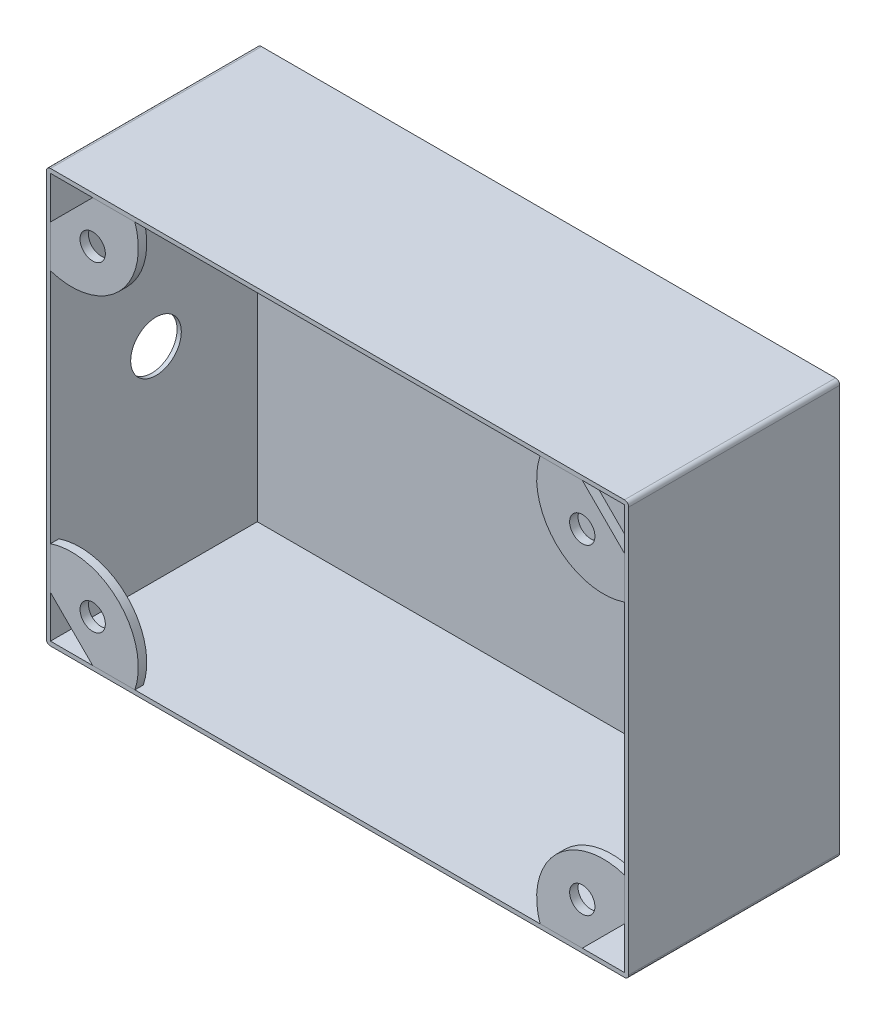
ISO-10303-21;
HEADER;
FILE_DESCRIPTION(('STEP AP214'),'2;1');
FILE_NAME('part.step','',(''),(''),'','','');
FILE_SCHEMA(('AUTOMOTIVE_DESIGN { 1 0 10303 214 1 1 1 1 }'));
ENDSEC;
DATA;
#1=APPLICATION_CONTEXT('core data for automotive mechanical design processes');
#2=APPLICATION_PROTOCOL_DEFINITION('international standard','automotive_design',2000,#1);
#3=PRODUCT_CONTEXT('',#1,'mechanical');
#4=PRODUCT('Part','Part','',(#3));
#5=PRODUCT_RELATED_PRODUCT_CATEGORY('part','',(#4));
#6=PRODUCT_DEFINITION_FORMATION('','',#4);
#7=PRODUCT_DEFINITION_CONTEXT('part definition',#1,'design');
#8=PRODUCT_DEFINITION('design','',#6,#7);
#9=PRODUCT_DEFINITION_SHAPE('','',#8);
#10=(LENGTH_UNIT() NAMED_UNIT(*) SI_UNIT(.MILLI.,.METRE.));
#11=(NAMED_UNIT(*) PLANE_ANGLE_UNIT() SI_UNIT($,.RADIAN.));
#12=(NAMED_UNIT(*) SI_UNIT($,.STERADIAN.) SOLID_ANGLE_UNIT());
#13=UNCERTAINTY_MEASURE_WITH_UNIT(LENGTH_MEASURE(1.E-05),#10,'distance_accuracy_value','');
#14=(GEOMETRIC_REPRESENTATION_CONTEXT(3) GLOBAL_UNCERTAINTY_ASSIGNED_CONTEXT((#13)) GLOBAL_UNIT_ASSIGNED_CONTEXT((#10,
#11,#12)) REPRESENTATION_CONTEXT('',''));
#15=CARTESIAN_POINT('',(0.,0.,0.));
#16=DIRECTION('',(0.,0.,1.));
#17=DIRECTION('',(1.,0.,0.));
#18=AXIS2_PLACEMENT_3D('',#15,#16,#17);
#19=CARTESIAN_POINT('',(-68.,-38.,48.));
#20=DIRECTION('',(-0.707106781186547,-0.707106781186547,0.));
#21=DIRECTION('',(0.707106781186548,-0.707106781186548,0.));
#22=AXIS2_PLACEMENT_3D('',#19,#20,#21);
#23=PLANE('',#22);
#24=DIRECTION('',(0.707106781186548,-0.707106781186548,0.));
#25=VECTOR('',#24,1.);
#26=CARTESIAN_POINT('',(-68.,-38.,50.));
#27=LINE('',#26,#25);
#28=CARTESIAN_POINT('',(-68.,-38.,50.));
#29=VERTEX_POINT('',#28);
#30=CARTESIAN_POINT('',(-58.,-48.,50.));
#31=VERTEX_POINT('',#30);
#32=EDGE_CURVE('E134',#29,#31,#27,.T.);
#33=ORIENTED_EDGE('',*,*,#32,.F.);
#34=DIRECTION('',(0.,0.,1.));
#35=VECTOR('',#34,1.);
#36=CARTESIAN_POINT('',(-68.,-38.,48.));
#37=LINE('',#36,#35);
#38=CARTESIAN_POINT('',(-68.,-38.,48.));
#39=VERTEX_POINT('',#38);
#40=EDGE_CURVE('E109',#39,#29,#37,.T.);
#41=ORIENTED_EDGE('',*,*,#40,.F.);
#42=DIRECTION('',(0.707106781186548,-0.707106781186548,0.));
#43=VECTOR('',#42,1.);
#44=CARTESIAN_POINT('',(-68.,-38.,48.));
#45=LINE('',#44,#43);
#46=CARTESIAN_POINT('',(-58.,-48.,48.));
#47=VERTEX_POINT('',#46);
#48=EDGE_CURVE('E127',#39,#47,#45,.T.);
#49=ORIENTED_EDGE('',*,*,#48,.T.);
#50=DIRECTION('',(0.,0.,1.));
#51=VECTOR('',#50,1.);
#52=CARTESIAN_POINT('',(-58.,-48.,48.));
#53=LINE('',#52,#51);
#54=EDGE_CURVE('E81',#47,#31,#53,.T.);
#55=ORIENTED_EDGE('',*,*,#54,.T.);
#56=EDGE_LOOP('',(#33,#41,#49,#55));
#57=FACE_BOUND('',#56,.T.);
#58=ADVANCED_FACE('F64',(#57),#23,.T.);
#59=CARTESIAN_POINT('',(-68.,-38.,48.));
#60=DIRECTION('',(-1.,0.,0.));
#61=DIRECTION('',(0.,0.,1.));
#62=AXIS2_PLACEMENT_3D('',#59,#60,#61);
#63=PLANE('',#62);
#64=DIRECTION('',(0.,-1.,0.));
#65=VECTOR('',#64,1.);
#66=CARTESIAN_POINT('',(-68.,-38.,50.));
#67=LINE('',#66,#65);
#68=CARTESIAN_POINT('',(-68.,-28.,50.));
#69=VERTEX_POINT('',#68);
#70=EDGE_CURVE('E123',#69,#29,#67,.T.);
#71=ORIENTED_EDGE('',*,*,#70,.F.);
#72=DIRECTION('',(0.,0.,1.));
#73=VECTOR('',#72,1.);
#74=CARTESIAN_POINT('',(-68.,-28.,48.));
#75=LINE('',#74,#73);
#76=CARTESIAN_POINT('',(-68.,-28.,48.));
#77=VERTEX_POINT('',#76);
#78=EDGE_CURVE('E111',#77,#69,#75,.T.);
#79=ORIENTED_EDGE('',*,*,#78,.F.);
#80=DIRECTION('',(0.,-1.,0.));
#81=VECTOR('',#80,1.);
#82=CARTESIAN_POINT('',(-68.,-38.,48.));
#83=LINE('',#82,#81);
#84=EDGE_CURVE('E136',#77,#39,#83,.T.);
#85=ORIENTED_EDGE('',*,*,#84,.T.);
#86=ORIENTED_EDGE('',*,*,#40,.T.);
#87=EDGE_LOOP('',(#71,#79,#85,#86));
#88=FACE_BOUND('',#87,.T.);
#89=ADVANCED_FACE('F126',(#88),#63,.T.);
#90=CARTESIAN_POINT('',(-63.,-43.,48.));
#91=DIRECTION('',(0.,0.,1.));
#92=DIRECTION('',(1.,0.,0.));
#93=AXIS2_PLACEMENT_3D('',#90,#91,#92);
#94=CYLINDRICAL_SURFACE('',#93,15.8113883008419);
#95=CARTESIAN_POINT('',(-63.,-43.,50.));
#96=DIRECTION('',(0.,0.,1.));
#97=DIRECTION('',(-1.,0.,0.));
#98=AXIS2_PLACEMENT_3D('',#95,#96,#97);
#99=CIRCLE('',#98,15.8113883008419);
#100=CARTESIAN_POINT('',(-48.,-48.,50.));
#101=VERTEX_POINT('',#100);
#102=EDGE_CURVE('E114',#101,#69,#99,.T.);
#103=ORIENTED_EDGE('',*,*,#102,.F.);
#104=DIRECTION('',(0.,0.,1.));
#105=VECTOR('',#104,1.);
#106=CARTESIAN_POINT('',(-48.,-48.,48.));
#107=LINE('',#106,#105);
#108=CARTESIAN_POINT('',(-48.,-48.,48.));
#109=VERTEX_POINT('',#108);
#110=EDGE_CURVE('E98',#109,#101,#107,.T.);
#111=ORIENTED_EDGE('',*,*,#110,.F.);
#112=CARTESIAN_POINT('',(-63.,-43.,48.));
#113=DIRECTION('',(0.,0.,1.));
#114=DIRECTION('',(-1.,0.,0.));
#115=AXIS2_PLACEMENT_3D('',#112,#113,#114);
#116=CIRCLE('',#115,15.8113883008419);
#117=EDGE_CURVE('E116',#109,#77,#116,.T.);
#118=ORIENTED_EDGE('',*,*,#117,.T.);
#119=ORIENTED_EDGE('',*,*,#78,.T.);
#120=EDGE_LOOP('',(#103,#111,#118,#119));
#121=FACE_BOUND('',#120,.T.);
#122=ADVANCED_FACE('F113',(#121),#94,.T.);
#123=CARTESIAN_POINT('',(-58.,-48.,48.));
#124=DIRECTION('',(0.,-1.,0.));
#125=DIRECTION('',(0.,0.,-1.));
#126=AXIS2_PLACEMENT_3D('',#123,#124,#125);
#127=PLANE('',#126);
#128=DIRECTION('',(1.,0.,0.));
#129=VECTOR('',#128,1.);
#130=CARTESIAN_POINT('',(-58.,-48.,50.));
#131=LINE('',#130,#129);
#132=EDGE_CURVE('E124',#31,#101,#131,.T.);
#133=ORIENTED_EDGE('',*,*,#132,.F.);
#134=ORIENTED_EDGE('',*,*,#54,.F.);
#135=DIRECTION('',(1.,0.,0.));
#136=VECTOR('',#135,1.);
#137=CARTESIAN_POINT('',(-58.,-48.,48.));
#138=LINE('',#137,#136);
#139=EDGE_CURVE('E129',#47,#109,#138,.T.);
#140=ORIENTED_EDGE('',*,*,#139,.T.);
#141=ORIENTED_EDGE('',*,*,#110,.T.);
#142=EDGE_LOOP('',(#133,#134,#140,#141));
#143=FACE_BOUND('',#142,.T.);
#144=ADVANCED_FACE('F139',(#143),#127,.T.);
#145=CARTESIAN_POINT('',(-63.,-43.,48.));
#146=DIRECTION('',(0.,0.,-1.));
#147=DIRECTION('',(-1.,0.,0.));
#148=AXIS2_PLACEMENT_3D('',#145,#146,#147);
#149=PLANE('',#148);
#150=CARTESIAN_POINT('',(-58.,-38.,48.));
#151=DIRECTION('',(0.,0.,1.));
#152=DIRECTION('',(-1.,0.,0.));
#153=AXIS2_PLACEMENT_3D('',#150,#151,#152);
#154=CIRCLE('',#153,3.);
#155=CARTESIAN_POINT('',(-61.,-38.,48.));
#156=VERTEX_POINT('',#155);
#157=EDGE_CURVE('E68',#156,#156,#154,.T.);
#158=ORIENTED_EDGE('',*,*,#157,.T.);
#159=EDGE_LOOP('',(#158));
#160=FACE_BOUND('',#159,.T.);
#161=ORIENTED_EDGE('',*,*,#48,.F.);
#162=ORIENTED_EDGE('',*,*,#84,.F.);
#163=ORIENTED_EDGE('',*,*,#117,.F.);
#164=ORIENTED_EDGE('',*,*,#139,.F.);
#165=EDGE_LOOP('',(#161,#162,#163,#164));
#166=FACE_BOUND('',#165,.T.);
#167=ADVANCED_FACE('F142',(#160,#166),#149,.T.);
#168=CARTESIAN_POINT('',(-63.,-43.,50.));
#169=DIRECTION('',(0.,0.,-1.));
#170=DIRECTION('',(-1.,0.,0.));
#171=AXIS2_PLACEMENT_3D('',#168,#169,#170);
#172=PLANE('',#171);
#173=CARTESIAN_POINT('',(-58.,-38.,50.));
#174=DIRECTION('',(0.,0.,1.));
#175=DIRECTION('',(-1.,0.,0.));
#176=AXIS2_PLACEMENT_3D('',#173,#174,#175);
#177=CIRCLE('',#176,3.);
#178=CARTESIAN_POINT('',(-61.,-38.,50.));
#179=VERTEX_POINT('',#178);
#180=EDGE_CURVE('E13',#179,#179,#177,.T.);
#181=ORIENTED_EDGE('',*,*,#180,.F.);
#182=EDGE_LOOP('',(#181));
#183=FACE_BOUND('',#182,.T.);
#184=ORIENTED_EDGE('',*,*,#32,.T.);
#185=ORIENTED_EDGE('',*,*,#132,.T.);
#186=ORIENTED_EDGE('',*,*,#102,.T.);
#187=ORIENTED_EDGE('',*,*,#70,.T.);
#188=EDGE_LOOP('',(#184,#185,#186,#187));
#189=FACE_BOUND('',#188,.T.);
#190=ADVANCED_FACE('F122',(#183,#189),#172,.F.);
#191=CARTESIAN_POINT('',(-58.,-38.,48.));
#192=DIRECTION('',(0.,0.,1.));
#193=DIRECTION('',(1.,0.,0.));
#194=AXIS2_PLACEMENT_3D('',#191,#192,#193);
#195=CYLINDRICAL_SURFACE('',#194,3.);
#196=ORIENTED_EDGE('',*,*,#157,.F.);
#197=EDGE_LOOP('',(#196));
#198=FACE_BOUND('',#197,.T.);
#199=ORIENTED_EDGE('',*,*,#180,.T.);
#200=EDGE_LOOP('',(#199));
#201=FACE_BOUND('',#200,.T.);
#202=ADVANCED_FACE('F66',(#198,#201),#195,.F.);
#203=CLOSED_SHELL('',(#58,#89,#122,#144,#167,#190,#202));
#204=MANIFOLD_SOLID_BREP('B2',#203);
#205=CARTESIAN_POINT('',(63.,-43.,48.));
#206=DIRECTION('',(0.,0.,1.));
#207=DIRECTION('',(1.,0.,0.));
#208=AXIS2_PLACEMENT_3D('',#205,#206,#207);
#209=CYLINDRICAL_SURFACE('',#208,15.8113883008419);
#210=CARTESIAN_POINT('',(63.,-43.,50.));
#211=DIRECTION('',(0.,0.,1.));
#212=DIRECTION('',(1.,0.,0.));
#213=AXIS2_PLACEMENT_3D('',#210,#211,#212);
#214=CIRCLE('',#213,15.8113883008419);
#215=CARTESIAN_POINT('',(68.,-28.,50.));
#216=VERTEX_POINT('',#215);
#217=CARTESIAN_POINT('',(48.,-48.,50.));
#218=VERTEX_POINT('',#217);
#219=EDGE_CURVE('E303',#216,#218,#214,.T.);
#220=ORIENTED_EDGE('',*,*,#219,.F.);
#221=DIRECTION('',(0.,0.,1.));
#222=VECTOR('',#221,1.);
#223=CARTESIAN_POINT('',(68.,-28.,48.));
#224=LINE('',#223,#222);
#225=CARTESIAN_POINT('',(68.,-28.,48.));
#226=VERTEX_POINT('',#225);
#227=EDGE_CURVE('E278',#226,#216,#224,.T.);
#228=ORIENTED_EDGE('',*,*,#227,.F.);
#229=CARTESIAN_POINT('',(63.,-43.,48.));
#230=DIRECTION('',(0.,0.,1.));
#231=DIRECTION('',(1.,0.,0.));
#232=AXIS2_PLACEMENT_3D('',#229,#230,#231);
#233=CIRCLE('',#232,15.8113883008419);
#234=CARTESIAN_POINT('',(48.,-48.,48.));
#235=VERTEX_POINT('',#234);
#236=EDGE_CURVE('E296',#226,#235,#233,.T.);
#237=ORIENTED_EDGE('',*,*,#236,.T.);
#238=DIRECTION('',(0.,0.,1.));
#239=VECTOR('',#238,1.);
#240=CARTESIAN_POINT('',(48.,-48.,48.));
#241=LINE('',#240,#239);
#242=EDGE_CURVE('E250',#235,#218,#241,.T.);
#243=ORIENTED_EDGE('',*,*,#242,.T.);
#244=EDGE_LOOP('',(#220,#228,#237,#243));
#245=FACE_BOUND('',#244,.T.);
#246=ADVANCED_FACE('F233',(#245),#209,.T.);
#247=CARTESIAN_POINT('',(68.,-38.,48.));
#248=DIRECTION('',(1.,0.,0.));
#249=DIRECTION('',(0.,0.,-1.));
#250=AXIS2_PLACEMENT_3D('',#247,#248,#249);
#251=PLANE('',#250);
#252=DIRECTION('',(0.,1.,0.));
#253=VECTOR('',#252,1.);
#254=CARTESIAN_POINT('',(68.,-38.,50.));
#255=LINE('',#254,#253);
#256=CARTESIAN_POINT('',(68.,-38.,50.));
#257=VERTEX_POINT('',#256);
#258=EDGE_CURVE('E292',#257,#216,#255,.T.);
#259=ORIENTED_EDGE('',*,*,#258,.F.);
#260=DIRECTION('',(0.,0.,1.));
#261=VECTOR('',#260,1.);
#262=CARTESIAN_POINT('',(68.,-38.,48.));
#263=LINE('',#262,#261);
#264=CARTESIAN_POINT('',(68.,-38.,48.));
#265=VERTEX_POINT('',#264);
#266=EDGE_CURVE('E280',#265,#257,#263,.T.);
#267=ORIENTED_EDGE('',*,*,#266,.F.);
#268=DIRECTION('',(0.,1.,0.));
#269=VECTOR('',#268,1.);
#270=CARTESIAN_POINT('',(68.,-38.,48.));
#271=LINE('',#270,#269);
#272=EDGE_CURVE('E305',#265,#226,#271,.T.);
#273=ORIENTED_EDGE('',*,*,#272,.T.);
#274=ORIENTED_EDGE('',*,*,#227,.T.);
#275=EDGE_LOOP('',(#259,#267,#273,#274));
#276=FACE_BOUND('',#275,.T.);
#277=ADVANCED_FACE('F295',(#276),#251,.T.);
#278=CARTESIAN_POINT('',(68.,-38.,48.));
#279=DIRECTION('',(0.707106781186547,-0.707106781186547,0.));
#280=DIRECTION('',(0.707106781186548,0.707106781186548,0.));
#281=AXIS2_PLACEMENT_3D('',#278,#279,#280);
#282=PLANE('',#281);
#283=DIRECTION('',(0.707106781186548,0.707106781186548,0.));
#284=VECTOR('',#283,1.);
#285=CARTESIAN_POINT('',(68.,-38.,50.));
#286=LINE('',#285,#284);
#287=CARTESIAN_POINT('',(58.,-48.,50.));
#288=VERTEX_POINT('',#287);
#289=EDGE_CURVE('E283',#288,#257,#286,.T.);
#290=ORIENTED_EDGE('',*,*,#289,.F.);
#291=DIRECTION('',(0.,0.,1.));
#292=VECTOR('',#291,1.);
#293=CARTESIAN_POINT('',(58.,-48.,48.));
#294=LINE('',#293,#292);
#295=CARTESIAN_POINT('',(58.,-48.,48.));
#296=VERTEX_POINT('',#295);
#297=EDGE_CURVE('E267',#296,#288,#294,.T.);
#298=ORIENTED_EDGE('',*,*,#297,.F.);
#299=DIRECTION('',(0.707106781186548,0.707106781186548,0.));
#300=VECTOR('',#299,1.);
#301=CARTESIAN_POINT('',(68.,-38.,48.));
#302=LINE('',#301,#300);
#303=EDGE_CURVE('E285',#296,#265,#302,.T.);
#304=ORIENTED_EDGE('',*,*,#303,.T.);
#305=ORIENTED_EDGE('',*,*,#266,.T.);
#306=EDGE_LOOP('',(#290,#298,#304,#305));
#307=FACE_BOUND('',#306,.T.);
#308=ADVANCED_FACE('F282',(#307),#282,.T.);
#309=CARTESIAN_POINT('',(58.,-48.,48.));
#310=DIRECTION('',(0.,-1.,0.));
#311=DIRECTION('',(0.,0.,-1.));
#312=AXIS2_PLACEMENT_3D('',#309,#310,#311);
#313=PLANE('',#312);
#314=DIRECTION('',(1.,0.,0.));
#315=VECTOR('',#314,1.);
#316=CARTESIAN_POINT('',(58.,-48.,50.));
#317=LINE('',#316,#315);
#318=EDGE_CURVE('E293',#218,#288,#317,.T.);
#319=ORIENTED_EDGE('',*,*,#318,.F.);
#320=ORIENTED_EDGE('',*,*,#242,.F.);
#321=DIRECTION('',(1.,0.,0.));
#322=VECTOR('',#321,1.);
#323=CARTESIAN_POINT('',(58.,-48.,48.));
#324=LINE('',#323,#322);
#325=EDGE_CURVE('E298',#235,#296,#324,.T.);
#326=ORIENTED_EDGE('',*,*,#325,.T.);
#327=ORIENTED_EDGE('',*,*,#297,.T.);
#328=EDGE_LOOP('',(#319,#320,#326,#327));
#329=FACE_BOUND('',#328,.T.);
#330=ADVANCED_FACE('F308',(#329),#313,.T.);
#331=CARTESIAN_POINT('',(63.,-43.,48.));
#332=DIRECTION('',(0.,0.,1.));
#333=DIRECTION('',(1.,0.,0.));
#334=AXIS2_PLACEMENT_3D('',#331,#332,#333);
#335=PLANE('',#334);
#336=CARTESIAN_POINT('',(58.,-38.,48.));
#337=DIRECTION('',(0.,0.,1.));
#338=DIRECTION('',(1.,0.,0.));
#339=AXIS2_PLACEMENT_3D('',#336,#337,#338);
#340=CIRCLE('',#339,3.);
#341=CARTESIAN_POINT('',(61.,-38.,48.));
#342=VERTEX_POINT('',#341);
#343=EDGE_CURVE('E237',#342,#342,#340,.T.);
#344=ORIENTED_EDGE('',*,*,#343,.T.);
#345=EDGE_LOOP('',(#344));
#346=FACE_BOUND('',#345,.T.);
#347=ORIENTED_EDGE('',*,*,#236,.F.);
#348=ORIENTED_EDGE('',*,*,#272,.F.);
#349=ORIENTED_EDGE('',*,*,#303,.F.);
#350=ORIENTED_EDGE('',*,*,#325,.F.);
#351=EDGE_LOOP('',(#347,#348,#349,#350));
#352=FACE_BOUND('',#351,.T.);
#353=ADVANCED_FACE('F311',(#346,#352),#335,.F.);
#354=CARTESIAN_POINT('',(63.,-43.,50.));
#355=DIRECTION('',(0.,0.,1.));
#356=DIRECTION('',(1.,0.,0.));
#357=AXIS2_PLACEMENT_3D('',#354,#355,#356);
#358=PLANE('',#357);
#359=CARTESIAN_POINT('',(58.,-38.,50.));
#360=DIRECTION('',(0.,0.,1.));
#361=DIRECTION('',(1.,0.,0.));
#362=AXIS2_PLACEMENT_3D('',#359,#360,#361);
#363=CIRCLE('',#362,3.);
#364=CARTESIAN_POINT('',(61.,-38.,50.));
#365=VERTEX_POINT('',#364);
#366=EDGE_CURVE('E62',#365,#365,#363,.T.);
#367=ORIENTED_EDGE('',*,*,#366,.F.);
#368=EDGE_LOOP('',(#367));
#369=FACE_BOUND('',#368,.T.);
#370=ORIENTED_EDGE('',*,*,#219,.T.);
#371=ORIENTED_EDGE('',*,*,#318,.T.);
#372=ORIENTED_EDGE('',*,*,#289,.T.);
#373=ORIENTED_EDGE('',*,*,#258,.T.);
#374=EDGE_LOOP('',(#370,#371,#372,#373));
#375=FACE_BOUND('',#374,.T.);
#376=ADVANCED_FACE('F291',(#369,#375),#358,.T.);
#377=CARTESIAN_POINT('',(58.,-38.,48.));
#378=DIRECTION('',(0.,0.,1.));
#379=DIRECTION('',(1.,0.,0.));
#380=AXIS2_PLACEMENT_3D('',#377,#378,#379);
#381=CYLINDRICAL_SURFACE('',#380,3.);
#382=ORIENTED_EDGE('',*,*,#343,.F.);
#383=EDGE_LOOP('',(#382));
#384=FACE_BOUND('',#383,.T.);
#385=ORIENTED_EDGE('',*,*,#366,.T.);
#386=EDGE_LOOP('',(#385));
#387=FACE_BOUND('',#386,.T.);
#388=ADVANCED_FACE('F235',(#384,#387),#381,.F.);
#389=CLOSED_SHELL('',(#246,#277,#308,#330,#353,#376,#388));
#390=MANIFOLD_SOLID_BREP('B7',#389);
#391=CARTESIAN_POINT('',(68.,38.,48.));
#392=DIRECTION('',(0.707106781186547,0.707106781186547,0.));
#393=DIRECTION('',(-0.707106781186548,0.707106781186548,0.));
#394=AXIS2_PLACEMENT_3D('',#391,#392,#393);
#395=PLANE('',#394);
#396=DIRECTION('',(-0.707106781186548,0.707106781186548,0.));
#397=VECTOR('',#396,1.);
#398=CARTESIAN_POINT('',(68.,38.,50.));
#399=LINE('',#398,#397);
#400=CARTESIAN_POINT('',(68.,38.,50.));
#401=VERTEX_POINT('',#400);
#402=CARTESIAN_POINT('',(58.,48.,50.));
#403=VERTEX_POINT('',#402);
#404=EDGE_CURVE('E472',#401,#403,#399,.T.);
#405=ORIENTED_EDGE('',*,*,#404,.F.);
#406=DIRECTION('',(0.,0.,1.));
#407=VECTOR('',#406,1.);
#408=CARTESIAN_POINT('',(68.,38.,48.));
#409=LINE('',#408,#407);
#410=CARTESIAN_POINT('',(68.,38.,48.));
#411=VERTEX_POINT('',#410);
#412=EDGE_CURVE('E447',#411,#401,#409,.T.);
#413=ORIENTED_EDGE('',*,*,#412,.F.);
#414=DIRECTION('',(-0.707106781186548,0.707106781186548,0.));
#415=VECTOR('',#414,1.);
#416=CARTESIAN_POINT('',(68.,38.,48.));
#417=LINE('',#416,#415);
#418=CARTESIAN_POINT('',(58.,48.,48.));
#419=VERTEX_POINT('',#418);
#420=EDGE_CURVE('E465',#411,#419,#417,.T.);
#421=ORIENTED_EDGE('',*,*,#420,.T.);
#422=DIRECTION('',(0.,0.,1.));
#423=VECTOR('',#422,1.);
#424=CARTESIAN_POINT('',(58.,48.,48.));
#425=LINE('',#424,#423);
#426=EDGE_CURVE('E419',#419,#403,#425,.T.);
#427=ORIENTED_EDGE('',*,*,#426,.T.);
#428=EDGE_LOOP('',(#405,#413,#421,#427));
#429=FACE_BOUND('',#428,.T.);
#430=ADVANCED_FACE('F402',(#429),#395,.T.);
#431=CARTESIAN_POINT('',(68.,38.,48.));
#432=DIRECTION('',(1.,0.,0.));
#433=DIRECTION('',(0.,0.,-1.));
#434=AXIS2_PLACEMENT_3D('',#431,#432,#433);
#435=PLANE('',#434);
#436=DIRECTION('',(0.,1.,0.));
#437=VECTOR('',#436,1.);
#438=CARTESIAN_POINT('',(68.,38.,50.));
#439=LINE('',#438,#437);
#440=CARTESIAN_POINT('',(68.,28.,50.));
#441=VERTEX_POINT('',#440);
#442=EDGE_CURVE('E461',#441,#401,#439,.T.);
#443=ORIENTED_EDGE('',*,*,#442,.F.);
#444=DIRECTION('',(0.,0.,1.));
#445=VECTOR('',#444,1.);
#446=CARTESIAN_POINT('',(68.,28.,48.));
#447=LINE('',#446,#445);
#448=CARTESIAN_POINT('',(68.,28.,48.));
#449=VERTEX_POINT('',#448);
#450=EDGE_CURVE('E449',#449,#441,#447,.T.);
#451=ORIENTED_EDGE('',*,*,#450,.F.);
#452=DIRECTION('',(0.,1.,0.));
#453=VECTOR('',#452,1.);
#454=CARTESIAN_POINT('',(68.,38.,48.));
#455=LINE('',#454,#453);
#456=EDGE_CURVE('E474',#449,#411,#455,.T.);
#457=ORIENTED_EDGE('',*,*,#456,.T.);
#458=ORIENTED_EDGE('',*,*,#412,.T.);
#459=EDGE_LOOP('',(#443,#451,#457,#458));
#460=FACE_BOUND('',#459,.T.);
#461=ADVANCED_FACE('F464',(#460),#435,.T.);
#462=CARTESIAN_POINT('',(63.,43.,48.));
#463=DIRECTION('',(0.,0.,1.));
#464=DIRECTION('',(1.,0.,0.));
#465=AXIS2_PLACEMENT_3D('',#462,#463,#464);
#466=CYLINDRICAL_SURFACE('',#465,15.8113883008419);
#467=CARTESIAN_POINT('',(63.,43.,50.));
#468=DIRECTION('',(0.,0.,1.));
#469=DIRECTION('',(-1.,0.,0.));
#470=AXIS2_PLACEMENT_3D('',#467,#468,#469);
#471=CIRCLE('',#470,15.8113883008419);
#472=CARTESIAN_POINT('',(48.,48.,50.));
#473=VERTEX_POINT('',#472);
#474=EDGE_CURVE('E452',#473,#441,#471,.T.);
#475=ORIENTED_EDGE('',*,*,#474,.F.);
#476=DIRECTION('',(0.,0.,1.));
#477=VECTOR('',#476,1.);
#478=CARTESIAN_POINT('',(48.,48.,48.));
#479=LINE('',#478,#477);
#480=CARTESIAN_POINT('',(48.,48.,48.));
#481=VERTEX_POINT('',#480);
#482=EDGE_CURVE('E436',#481,#473,#479,.T.);
#483=ORIENTED_EDGE('',*,*,#482,.F.);
#484=CARTESIAN_POINT('',(63.,43.,48.));
#485=DIRECTION('',(0.,0.,1.));
#486=DIRECTION('',(-1.,0.,0.));
#487=AXIS2_PLACEMENT_3D('',#484,#485,#486);
#488=CIRCLE('',#487,15.8113883008419);
#489=EDGE_CURVE('E454',#481,#449,#488,.T.);
#490=ORIENTED_EDGE('',*,*,#489,.T.);
#491=ORIENTED_EDGE('',*,*,#450,.T.);
#492=EDGE_LOOP('',(#475,#483,#490,#491));
#493=FACE_BOUND('',#492,.T.);
#494=ADVANCED_FACE('F451',(#493),#466,.T.);
#495=CARTESIAN_POINT('',(58.,48.,48.));
#496=DIRECTION('',(0.,1.,0.));
#497=DIRECTION('',(0.,0.,1.));
#498=AXIS2_PLACEMENT_3D('',#495,#496,#497);
#499=PLANE('',#498);
#500=DIRECTION('',(-1.,0.,0.));
#501=VECTOR('',#500,1.);
#502=CARTESIAN_POINT('',(58.,48.,50.));
#503=LINE('',#502,#501);
#504=EDGE_CURVE('E462',#403,#473,#503,.T.);
#505=ORIENTED_EDGE('',*,*,#504,.F.);
#506=ORIENTED_EDGE('',*,*,#426,.F.);
#507=DIRECTION('',(-1.,0.,0.));
#508=VECTOR('',#507,1.);
#509=CARTESIAN_POINT('',(58.,48.,48.));
#510=LINE('',#509,#508);
#511=EDGE_CURVE('E467',#419,#481,#510,.T.);
#512=ORIENTED_EDGE('',*,*,#511,.T.);
#513=ORIENTED_EDGE('',*,*,#482,.T.);
#514=EDGE_LOOP('',(#505,#506,#512,#513));
#515=FACE_BOUND('',#514,.T.);
#516=ADVANCED_FACE('F477',(#515),#499,.T.);
#517=CARTESIAN_POINT('',(63.,43.,48.));
#518=DIRECTION('',(0.,0.,-1.));
#519=DIRECTION('',(-1.,0.,0.));
#520=AXIS2_PLACEMENT_3D('',#517,#518,#519);
#521=PLANE('',#520);
#522=CARTESIAN_POINT('',(58.,38.,48.));
#523=DIRECTION('',(0.,0.,1.));
#524=DIRECTION('',(-1.,0.,0.));
#525=AXIS2_PLACEMENT_3D('',#522,#523,#524);
#526=CIRCLE('',#525,3.);
#527=CARTESIAN_POINT('',(55.,38.,48.));
#528=VERTEX_POINT('',#527);
#529=EDGE_CURVE('E406',#528,#528,#526,.T.);
#530=ORIENTED_EDGE('',*,*,#529,.T.);
#531=EDGE_LOOP('',(#530));
#532=FACE_BOUND('',#531,.T.);
#533=ORIENTED_EDGE('',*,*,#420,.F.);
#534=ORIENTED_EDGE('',*,*,#456,.F.);
#535=ORIENTED_EDGE('',*,*,#489,.F.);
#536=ORIENTED_EDGE('',*,*,#511,.F.);
#537=EDGE_LOOP('',(#533,#534,#535,#536));
#538=FACE_BOUND('',#537,.T.);
#539=ADVANCED_FACE('F480',(#532,#538),#521,.T.);
#540=CARTESIAN_POINT('',(63.,43.,50.));
#541=DIRECTION('',(0.,0.,-1.));
#542=DIRECTION('',(-1.,0.,0.));
#543=AXIS2_PLACEMENT_3D('',#540,#541,#542);
#544=PLANE('',#543);
#545=CARTESIAN_POINT('',(58.,38.,50.));
#546=DIRECTION('',(0.,0.,1.));
#547=DIRECTION('',(-1.,0.,0.));
#548=AXIS2_PLACEMENT_3D('',#545,#546,#547);
#549=CIRCLE('',#548,3.);
#550=CARTESIAN_POINT('',(55.,38.,50.));
#551=VERTEX_POINT('',#550);
#552=EDGE_CURVE('E231',#551,#551,#549,.T.);
#553=ORIENTED_EDGE('',*,*,#552,.F.);
#554=EDGE_LOOP('',(#553));
#555=FACE_BOUND('',#554,.T.);
#556=ORIENTED_EDGE('',*,*,#404,.T.);
#557=ORIENTED_EDGE('',*,*,#504,.T.);
#558=ORIENTED_EDGE('',*,*,#474,.T.);
#559=ORIENTED_EDGE('',*,*,#442,.T.);
#560=EDGE_LOOP('',(#556,#557,#558,#559));
#561=FACE_BOUND('',#560,.T.);
#562=ADVANCED_FACE('F460',(#555,#561),#544,.F.);
#563=CARTESIAN_POINT('',(58.,38.,48.));
#564=DIRECTION('',(0.,0.,1.));
#565=DIRECTION('',(1.,0.,0.));
#566=AXIS2_PLACEMENT_3D('',#563,#564,#565);
#567=CYLINDRICAL_SURFACE('',#566,3.);
#568=ORIENTED_EDGE('',*,*,#529,.F.);
#569=EDGE_LOOP('',(#568));
#570=FACE_BOUND('',#569,.T.);
#571=ORIENTED_EDGE('',*,*,#552,.T.);
#572=EDGE_LOOP('',(#571));
#573=FACE_BOUND('',#572,.T.);
#574=ADVANCED_FACE('F404',(#570,#573),#567,.F.);
#575=CLOSED_SHELL('',(#430,#461,#494,#516,#539,#562,#574));
#576=MANIFOLD_SOLID_BREP('B56',#575);
#577=CARTESIAN_POINT('',(-68.,38.,48.));
#578=DIRECTION('',(-1.,0.,0.));
#579=DIRECTION('',(0.,0.,1.));
#580=AXIS2_PLACEMENT_3D('',#577,#578,#579);
#581=PLANE('',#580);
#582=DIRECTION('',(0.,-1.,0.));
#583=VECTOR('',#582,1.);
#584=CARTESIAN_POINT('',(-68.,38.,50.));
#585=LINE('',#584,#583);
#586=CARTESIAN_POINT('',(-68.,38.,50.));
#587=VERTEX_POINT('',#586);
#588=CARTESIAN_POINT('',(-68.,28.,50.));
#589=VERTEX_POINT('',#588);
#590=EDGE_CURVE('E636',#587,#589,#585,.T.);
#591=ORIENTED_EDGE('',*,*,#590,.F.);
#592=DIRECTION('',(0.,0.,1.));
#593=VECTOR('',#592,1.);
#594=CARTESIAN_POINT('',(-68.,38.,48.));
#595=LINE('',#594,#593);
#596=CARTESIAN_POINT('',(-68.,38.,48.));
#597=VERTEX_POINT('',#596);
#598=EDGE_CURVE('E400',#597,#587,#595,.T.);
#599=ORIENTED_EDGE('',*,*,#598,.F.);
#600=DIRECTION('',(0.,-1.,0.));
#601=VECTOR('',#600,1.);
#602=CARTESIAN_POINT('',(-68.,38.,48.));
#603=LINE('',#602,#601);
#604=CARTESIAN_POINT('',(-68.,28.,48.));
#605=VERTEX_POINT('',#604);
#606=EDGE_CURVE('E629',#597,#605,#603,.T.);
#607=ORIENTED_EDGE('',*,*,#606,.T.);
#608=DIRECTION('',(0.,0.,1.));
#609=VECTOR('',#608,1.);
#610=CARTESIAN_POINT('',(-68.,28.,48.));
#611=LINE('',#610,#609);
#612=EDGE_CURVE('E574',#605,#589,#611,.T.);
#613=ORIENTED_EDGE('',*,*,#612,.T.);
#614=EDGE_LOOP('',(#591,#599,#607,#613));
#615=FACE_BOUND('',#614,.T.);
#616=ADVANCED_FACE('F571',(#615),#581,.T.);
#617=CARTESIAN_POINT('',(-68.,38.,48.));
#618=DIRECTION('',(-0.707106781186547,0.707106781186547,0.));
#619=DIRECTION('',(-0.707106781186548,-0.707106781186548,0.));
#620=AXIS2_PLACEMENT_3D('',#617,#618,#619);
#621=PLANE('',#620);
#622=DIRECTION('',(-0.707106781186548,-0.707106781186548,0.));
#623=VECTOR('',#622,1.);
#624=CARTESIAN_POINT('',(-68.,38.,50.));
#625=LINE('',#624,#623);
#626=CARTESIAN_POINT('',(-58.,48.,50.));
#627=VERTEX_POINT('',#626);
#628=EDGE_CURVE('E631',#627,#587,#625,.T.);
#629=ORIENTED_EDGE('',*,*,#628,.F.);
#630=DIRECTION('',(0.,0.,1.));
#631=VECTOR('',#630,1.);
#632=CARTESIAN_POINT('',(-58.,48.,48.));
#633=LINE('',#632,#631);
#634=CARTESIAN_POINT('',(-58.,48.,48.));
#635=VERTEX_POINT('',#634);
#636=EDGE_CURVE('E580',#635,#627,#633,.T.);
#637=ORIENTED_EDGE('',*,*,#636,.F.);
#638=DIRECTION('',(-0.707106781186548,-0.707106781186548,0.));
#639=VECTOR('',#638,1.);
#640=CARTESIAN_POINT('',(-68.,38.,48.));
#641=LINE('',#640,#639);
#642=EDGE_CURVE('E626',#635,#597,#641,.T.);
#643=ORIENTED_EDGE('',*,*,#642,.T.);
#644=ORIENTED_EDGE('',*,*,#598,.T.);
#645=EDGE_LOOP('',(#629,#637,#643,#644));
#646=FACE_BOUND('',#645,.T.);
#647=ADVANCED_FACE('F647',(#646),#621,.T.);
#648=CARTESIAN_POINT('',(-58.,48.,48.));
#649=DIRECTION('',(0.,1.,0.));
#650=DIRECTION('',(0.,0.,1.));
#651=AXIS2_PLACEMENT_3D('',#648,#649,#650);
#652=PLANE('',#651);
#653=DIRECTION('',(-1.,0.,0.));
#654=VECTOR('',#653,1.);
#655=CARTESIAN_POINT('',(-58.,48.,50.));
#656=LINE('',#655,#654);
#657=CARTESIAN_POINT('',(-48.,48.,50.));
#658=VERTEX_POINT('',#657);
#659=EDGE_CURVE('E621',#658,#627,#656,.T.);
#660=ORIENTED_EDGE('',*,*,#659,.F.);
#661=DIRECTION('',(0.,0.,1.));
#662=VECTOR('',#661,1.);
#663=CARTESIAN_POINT('',(-48.,48.,48.));
#664=LINE('',#663,#662);
#665=CARTESIAN_POINT('',(-48.,48.,48.));
#666=VERTEX_POINT('',#665);
#667=EDGE_CURVE('E616',#666,#658,#664,.T.);
#668=ORIENTED_EDGE('',*,*,#667,.F.);
#669=DIRECTION('',(-1.,0.,0.));
#670=VECTOR('',#669,1.);
#671=CARTESIAN_POINT('',(-58.,48.,48.));
#672=LINE('',#671,#670);
#673=EDGE_CURVE('E619',#666,#635,#672,.T.);
#674=ORIENTED_EDGE('',*,*,#673,.T.);
#675=ORIENTED_EDGE('',*,*,#636,.T.);
#676=EDGE_LOOP('',(#660,#668,#674,#675));
#677=FACE_BOUND('',#676,.T.);
#678=ADVANCED_FACE('F618',(#677),#652,.T.);
#679=CARTESIAN_POINT('',(-63.,43.,48.));
#680=DIRECTION('',(0.,0.,1.));
#681=DIRECTION('',(1.,0.,0.));
#682=AXIS2_PLACEMENT_3D('',#679,#680,#681);
#683=CYLINDRICAL_SURFACE('',#682,15.8113883008419);
#684=CARTESIAN_POINT('',(-63.,43.,50.));
#685=DIRECTION('',(0.,0.,1.));
#686=DIRECTION('',(1.,0.,0.));
#687=AXIS2_PLACEMENT_3D('',#684,#685,#686);
#688=CIRCLE('',#687,15.8113883008419);
#689=EDGE_CURVE('E639',#589,#658,#688,.T.);
#690=ORIENTED_EDGE('',*,*,#689,.F.);
#691=ORIENTED_EDGE('',*,*,#612,.F.);
#692=CARTESIAN_POINT('',(-63.,43.,48.));
#693=DIRECTION('',(0.,0.,1.));
#694=DIRECTION('',(1.,0.,0.));
#695=AXIS2_PLACEMENT_3D('',#692,#693,#694);
#696=CIRCLE('',#695,15.8113883008419);
#697=EDGE_CURVE('E625',#605,#666,#696,.T.);
#698=ORIENTED_EDGE('',*,*,#697,.T.);
#699=ORIENTED_EDGE('',*,*,#667,.T.);
#700=EDGE_LOOP('',(#690,#691,#698,#699));
#701=FACE_BOUND('',#700,.T.);
#702=ADVANCED_FACE('F628',(#701),#683,.T.);
#703=CARTESIAN_POINT('',(-63.,43.,48.));
#704=DIRECTION('',(0.,0.,1.));
#705=DIRECTION('',(1.,0.,0.));
#706=AXIS2_PLACEMENT_3D('',#703,#704,#705);
#707=PLANE('',#706);
#708=CARTESIAN_POINT('',(-58.,38.,48.));
#709=DIRECTION('',(0.,0.,1.));
#710=DIRECTION('',(1.,0.,0.));
#711=AXIS2_PLACEMENT_3D('',#708,#709,#710);
#712=CIRCLE('',#711,3.);
#713=CARTESIAN_POINT('',(-55.,38.,48.));
#714=VERTEX_POINT('',#713);
#715=EDGE_CURVE('E640',#714,#714,#712,.T.);
#716=ORIENTED_EDGE('',*,*,#715,.T.);
#717=EDGE_LOOP('',(#716));
#718=FACE_BOUND('',#717,.T.);
#719=ORIENTED_EDGE('',*,*,#606,.F.);
#720=ORIENTED_EDGE('',*,*,#642,.F.);
#721=ORIENTED_EDGE('',*,*,#673,.F.);
#722=ORIENTED_EDGE('',*,*,#697,.F.);
#723=EDGE_LOOP('',(#719,#720,#721,#722));
#724=FACE_BOUND('',#723,.T.);
#725=ADVANCED_FACE('F624',(#718,#724),#707,.F.);
#726=CARTESIAN_POINT('',(-63.,43.,50.));
#727=DIRECTION('',(0.,0.,1.));
#728=DIRECTION('',(1.,0.,0.));
#729=AXIS2_PLACEMENT_3D('',#726,#727,#728);
#730=PLANE('',#729);
#731=CARTESIAN_POINT('',(-58.,38.,50.));
#732=DIRECTION('',(0.,0.,1.));
#733=DIRECTION('',(1.,0.,0.));
#734=AXIS2_PLACEMENT_3D('',#731,#732,#733);
#735=CIRCLE('',#734,3.);
#736=CARTESIAN_POINT('',(-55.,38.,50.));
#737=VERTEX_POINT('',#736);
#738=EDGE_CURVE('E677',#737,#737,#735,.T.);
#739=ORIENTED_EDGE('',*,*,#738,.F.);
#740=EDGE_LOOP('',(#739));
#741=FACE_BOUND('',#740,.T.);
#742=ORIENTED_EDGE('',*,*,#590,.T.);
#743=ORIENTED_EDGE('',*,*,#689,.T.);
#744=ORIENTED_EDGE('',*,*,#659,.T.);
#745=ORIENTED_EDGE('',*,*,#628,.T.);
#746=EDGE_LOOP('',(#742,#743,#744,#745));
#747=FACE_BOUND('',#746,.T.);
#748=ADVANCED_FACE('F646',(#741,#747),#730,.T.);
#749=CARTESIAN_POINT('',(-58.,38.,48.));
#750=DIRECTION('',(0.,0.,1.));
#751=DIRECTION('',(1.,0.,0.));
#752=AXIS2_PLACEMENT_3D('',#749,#750,#751);
#753=CYLINDRICAL_SURFACE('',#752,3.);
#754=ORIENTED_EDGE('',*,*,#715,.F.);
#755=EDGE_LOOP('',(#754));
#756=FACE_BOUND('',#755,.T.);
#757=ORIENTED_EDGE('',*,*,#738,.T.);
#758=EDGE_LOOP('',(#757));
#759=FACE_BOUND('',#758,.T.);
#760=ADVANCED_FACE('F665',(#756,#759),#753,.F.);
#761=CLOSED_SHELL('',(#616,#647,#678,#702,#725,#748,#760));
#762=MANIFOLD_SOLID_BREP('B225',#761);
#763=CARTESIAN_POINT('',(-68.,-48.,50.));
#764=DIRECTION('',(1.,0.,0.));
#765=DIRECTION('',(0.,0.,-1.));
#766=AXIS2_PLACEMENT_3D('',#763,#764,#765);
#767=PLANE('',#766);
#768=CARTESIAN_POINT('',(-68.,0.,25.));
#769=DIRECTION('',(1.,0.,0.));
#770=DIRECTION('',(0.,0.,-1.));
#771=AXIS2_PLACEMENT_3D('',#768,#769,#770);
#772=CIRCLE('',#771,6.);
#773=CARTESIAN_POINT('',(-68.,0.,19.));
#774=VERTEX_POINT('',#773);
#775=EDGE_CURVE('E1172',#774,#774,#772,.T.);
#776=ORIENTED_EDGE('',*,*,#775,.F.);
#777=EDGE_LOOP('',(#776));
#778=FACE_BOUND('',#777,.T.);
#779=DIRECTION('',(0.,0.,-1.));
#780=VECTOR('',#779,1.);
#781=CARTESIAN_POINT('',(-68.,-48.,50.));
#782=LINE('',#781,#780);
#783=CARTESIAN_POINT('',(-68.,-48.,50.));
#784=VERTEX_POINT('',#783);
#785=CARTESIAN_POINT('',(-68.,-48.,1.));
#786=VERTEX_POINT('',#785);
#787=EDGE_CURVE('E889',#784,#786,#782,.T.);
#788=ORIENTED_EDGE('',*,*,#787,.T.);
#789=DIRECTION('',(0.,-1.,0.));
#790=VECTOR('',#789,1.);
#791=CARTESIAN_POINT('',(-68.,-48.,1.));
#792=LINE('',#791,#790);
#793=CARTESIAN_POINT('',(-68.,48.,1.));
#794=VERTEX_POINT('',#793);
#795=EDGE_CURVE('E875',#794,#786,#792,.T.);
#796=ORIENTED_EDGE('',*,*,#795,.F.);
#797=DIRECTION('',(0.,0.,-1.));
#798=VECTOR('',#797,1.);
#799=CARTESIAN_POINT('',(-68.,48.,50.));
#800=LINE('',#799,#798);
#801=CARTESIAN_POINT('',(-68.,48.,50.));
#802=VERTEX_POINT('',#801);
#803=EDGE_CURVE('E886',#802,#794,#800,.T.);
#804=ORIENTED_EDGE('',*,*,#803,.F.);
#805=DIRECTION('',(0.,-1.,0.));
#806=VECTOR('',#805,1.);
#807=CARTESIAN_POINT('',(-68.,-48.,50.));
#808=LINE('',#807,#806);
#809=EDGE_CURVE('E1166',#802,#784,#808,.T.);
#810=ORIENTED_EDGE('',*,*,#809,.T.);
#811=EDGE_LOOP('',(#788,#796,#804,#810));
#812=FACE_BOUND('',#811,.T.);
#813=ADVANCED_FACE('F783',(#778,#812),#767,.T.);
#814=CARTESIAN_POINT('',(-68.,-48.,50.));
#815=DIRECTION('',(0.,1.,0.));
#816=DIRECTION('',(0.,0.,1.));
#817=AXIS2_PLACEMENT_3D('',#814,#815,#816);
#818=PLANE('',#817);
#819=DIRECTION('',(0.,0.,-1.));
#820=VECTOR('',#819,1.);
#821=CARTESIAN_POINT('',(68.,-48.,50.));
#822=LINE('',#821,#820);
#823=CARTESIAN_POINT('',(68.,-48.,50.));
#824=VERTEX_POINT('',#823);
#825=CARTESIAN_POINT('',(68.,-48.,1.));
#826=VERTEX_POINT('',#825);
#827=EDGE_CURVE('E897',#824,#826,#822,.T.);
#828=ORIENTED_EDGE('',*,*,#827,.T.);
#829=DIRECTION('',(1.,0.,0.));
#830=VECTOR('',#829,1.);
#831=CARTESIAN_POINT('',(-68.,-48.,1.));
#832=LINE('',#831,#830);
#833=EDGE_CURVE('E890',#786,#826,#832,.T.);
#834=ORIENTED_EDGE('',*,*,#833,.F.);
#835=ORIENTED_EDGE('',*,*,#787,.F.);
#836=DIRECTION('',(1.,0.,0.));
#837=VECTOR('',#836,1.);
#838=CARTESIAN_POINT('',(-68.,-48.,50.));
#839=LINE('',#838,#837);
#840=EDGE_CURVE('E1165',#784,#824,#839,.T.);
#841=ORIENTED_EDGE('',*,*,#840,.T.);
#842=EDGE_LOOP('',(#828,#834,#835,#841));
#843=FACE_BOUND('',#842,.T.);
#844=ADVANCED_FACE('F1000',(#843),#818,.T.);
#845=CARTESIAN_POINT('',(68.,-48.,50.));
#846=DIRECTION('',(-1.,0.,0.));
#847=DIRECTION('',(0.,-1.,0.));
#848=AXIS2_PLACEMENT_3D('',#845,#846,#847);
#849=PLANE('',#848);
#850=DIRECTION('',(0.,0.,-1.));
#851=VECTOR('',#850,1.);
#852=CARTESIAN_POINT('',(68.,48.,50.));
#853=LINE('',#852,#851);
#854=CARTESIAN_POINT('',(68.,48.,50.));
#855=VERTEX_POINT('',#854);
#856=CARTESIAN_POINT('',(68.,48.,1.));
#857=VERTEX_POINT('',#856);
#858=EDGE_CURVE('E895',#855,#857,#853,.T.);
#859=ORIENTED_EDGE('',*,*,#858,.T.);
#860=DIRECTION('',(0.,1.,0.));
#861=VECTOR('',#860,1.);
#862=CARTESIAN_POINT('',(68.,-48.,1.));
#863=LINE('',#862,#861);
#864=EDGE_CURVE('E878',#826,#857,#863,.T.);
#865=ORIENTED_EDGE('',*,*,#864,.F.);
#866=ORIENTED_EDGE('',*,*,#827,.F.);
#867=DIRECTION('',(0.,1.,0.));
#868=VECTOR('',#867,1.);
#869=CARTESIAN_POINT('',(68.,-48.,50.));
#870=LINE('',#869,#868);
#871=EDGE_CURVE('E899',#824,#855,#870,.T.);
#872=ORIENTED_EDGE('',*,*,#871,.T.);
#873=EDGE_LOOP('',(#859,#865,#866,#872));
#874=FACE_BOUND('',#873,.T.);
#875=ADVANCED_FACE('F1006',(#874),#849,.T.);
#876=CARTESIAN_POINT('',(-68.,48.,50.));
#877=DIRECTION('',(0.,-1.,0.));
#878=DIRECTION('',(0.,0.,-1.));
#879=AXIS2_PLACEMENT_3D('',#876,#877,#878);
#880=PLANE('',#879);
#881=ORIENTED_EDGE('',*,*,#803,.T.);
#882=DIRECTION('',(-1.,0.,0.));
#883=VECTOR('',#882,1.);
#884=CARTESIAN_POINT('',(-68.,48.,1.));
#885=LINE('',#884,#883);
#886=EDGE_CURVE('E872',#857,#794,#885,.T.);
#887=ORIENTED_EDGE('',*,*,#886,.F.);
#888=ORIENTED_EDGE('',*,*,#858,.F.);
#889=DIRECTION('',(-1.,0.,0.));
#890=VECTOR('',#889,1.);
#891=CARTESIAN_POINT('',(-68.,48.,50.));
#892=LINE('',#891,#890);
#893=EDGE_CURVE('E894',#855,#802,#892,.T.);
#894=ORIENTED_EDGE('',*,*,#893,.T.);
#895=EDGE_LOOP('',(#881,#887,#888,#894));
#896=FACE_BOUND('',#895,.T.);
#897=ADVANCED_FACE('F892',(#896),#880,.T.);
#898=CARTESIAN_POINT('',(0.,0.,50.));
#899=DIRECTION('',(0.,0.,-1.));
#900=DIRECTION('',(-1.,0.,0.));
#901=AXIS2_PLACEMENT_3D('',#898,#899,#900);
#902=PLANE('',#901);
#903=DIRECTION('',(0.,1.,0.));
#904=VECTOR('',#903,1.);
#905=CARTESIAN_POINT('',(69.,-49.,50.));
#906=LINE('',#905,#904);
#907=CARTESIAN_POINT('',(69.,-48.,50.));
#908=VERTEX_POINT('',#907);
#909=CARTESIAN_POINT('',(69.,48.,50.));
#910=VERTEX_POINT('',#909);
#911=EDGE_CURVE('E907',#908,#910,#906,.T.);
#912=ORIENTED_EDGE('',*,*,#911,.T.);
#913=CARTESIAN_POINT('',(68.,48.,50.));
#914=DIRECTION('',(0.,0.,-1.));
#915=DIRECTION('',(-1.,0.,0.));
#916=AXIS2_PLACEMENT_3D('',#913,#914,#915);
#917=CIRCLE('',#916,1.);
#918=CARTESIAN_POINT('',(68.,49.,50.));
#919=VERTEX_POINT('',#918);
#920=EDGE_CURVE('E950',#910,#919,#917,.F.);
#921=ORIENTED_EDGE('',*,*,#920,.T.);
#922=DIRECTION('',(-1.,0.,0.));
#923=VECTOR('',#922,1.);
#924=CARTESIAN_POINT('',(-69.,49.,50.));
#925=LINE('',#924,#923);
#926=CARTESIAN_POINT('',(-68.,49.,50.));
#927=VERTEX_POINT('',#926);
#928=EDGE_CURVE('E910',#919,#927,#925,.T.);
#929=ORIENTED_EDGE('',*,*,#928,.T.);
#930=CARTESIAN_POINT('',(-68.,48.,50.));
#931=DIRECTION('',(0.,0.,-1.));
#932=DIRECTION('',(-1.,0.,0.));
#933=AXIS2_PLACEMENT_3D('',#930,#931,#932);
#934=CIRCLE('',#933,1.);
#935=CARTESIAN_POINT('',(-69.,48.,50.));
#936=VERTEX_POINT('',#935);
#937=EDGE_CURVE('E945',#927,#936,#934,.F.);
#938=ORIENTED_EDGE('',*,*,#937,.T.);
#939=DIRECTION('',(0.,-1.,0.));
#940=VECTOR('',#939,1.);
#941=CARTESIAN_POINT('',(-69.,-49.,50.));
#942=LINE('',#941,#940);
#943=CARTESIAN_POINT('',(-69.,-48.,50.));
#944=VERTEX_POINT('',#943);
#945=EDGE_CURVE('E914',#936,#944,#942,.T.);
#946=ORIENTED_EDGE('',*,*,#945,.T.);
#947=CARTESIAN_POINT('',(-68.,-48.,50.));
#948=DIRECTION('',(0.,0.,-1.));
#949=DIRECTION('',(-1.,0.,0.));
#950=AXIS2_PLACEMENT_3D('',#947,#948,#949);
#951=CIRCLE('',#950,1.);
#952=CARTESIAN_POINT('',(-68.,-49.,50.));
#953=VERTEX_POINT('',#952);
#954=EDGE_CURVE('E805',#944,#953,#951,.F.);
#955=ORIENTED_EDGE('',*,*,#954,.T.);
#956=DIRECTION('',(1.,0.,0.));
#957=VECTOR('',#956,1.);
#958=CARTESIAN_POINT('',(-69.,-49.,50.));
#959=LINE('',#958,#957);
#960=CARTESIAN_POINT('',(68.,-49.,50.));
#961=VERTEX_POINT('',#960);
#962=EDGE_CURVE('E916',#953,#961,#959,.T.);
#963=ORIENTED_EDGE('',*,*,#962,.T.);
#964=CARTESIAN_POINT('',(68.,-48.,50.));
#965=DIRECTION('',(0.,0.,-1.));
#966=DIRECTION('',(-1.,0.,0.));
#967=AXIS2_PLACEMENT_3D('',#964,#965,#966);
#968=CIRCLE('',#967,1.);
#969=EDGE_CURVE('E948',#961,#908,#968,.F.);
#970=ORIENTED_EDGE('',*,*,#969,.T.);
#971=EDGE_LOOP('',(#912,#921,#929,#938,#946,#955,#963,#970));
#972=FACE_BOUND('',#971,.T.);
#973=ORIENTED_EDGE('',*,*,#809,.F.);
#974=ORIENTED_EDGE('',*,*,#893,.F.);
#975=ORIENTED_EDGE('',*,*,#871,.F.);
#976=ORIENTED_EDGE('',*,*,#840,.F.);
#977=EDGE_LOOP('',(#973,#974,#975,#976));
#978=FACE_BOUND('',#977,.T.);
#979=ADVANCED_FACE('F973',(#972,#978),#902,.F.);
#980=CARTESIAN_POINT('',(0.,0.,0.));
#981=DIRECTION('',(0.,0.,-1.));
#982=DIRECTION('',(-1.,0.,0.));
#983=AXIS2_PLACEMENT_3D('',#980,#981,#982);
#984=PLANE('',#983);
#985=DIRECTION('',(-1.,0.,0.));
#986=VECTOR('',#985,1.);
#987=CARTESIAN_POINT('',(-69.,49.,0.));
#988=LINE('',#987,#986);
#989=CARTESIAN_POINT('',(68.,49.,0.));
#990=VERTEX_POINT('',#989);
#991=CARTESIAN_POINT('',(-68.,49.,0.));
#992=VERTEX_POINT('',#991);
#993=EDGE_CURVE('E921',#990,#992,#988,.T.);
#994=ORIENTED_EDGE('',*,*,#993,.F.);
#995=CARTESIAN_POINT('',(68.,48.,0.));
#996=DIRECTION('',(0.,0.,-1.));
#997=DIRECTION('',(-1.,0.,0.));
#998=AXIS2_PLACEMENT_3D('',#995,#996,#997);
#999=CIRCLE('',#998,1.);
#1000=CARTESIAN_POINT('',(69.,48.,0.));
#1001=VERTEX_POINT('',#1000);
#1002=EDGE_CURVE('E938',#990,#1001,#999,.T.);
#1003=ORIENTED_EDGE('',*,*,#1002,.T.);
#1004=DIRECTION('',(0.,1.,0.));
#1005=VECTOR('',#1004,1.);
#1006=CARTESIAN_POINT('',(69.,-49.,0.));
#1007=LINE('',#1006,#1005);
#1008=CARTESIAN_POINT('',(69.,-48.,0.));
#1009=VERTEX_POINT('',#1008);
#1010=EDGE_CURVE('E906',#1009,#1001,#1007,.T.);
#1011=ORIENTED_EDGE('',*,*,#1010,.F.);
#1012=CARTESIAN_POINT('',(68.,-48.,0.));
#1013=DIRECTION('',(0.,0.,-1.));
#1014=DIRECTION('',(-1.,0.,0.));
#1015=AXIS2_PLACEMENT_3D('',#1012,#1013,#1014);
#1016=CIRCLE('',#1015,1.);
#1017=CARTESIAN_POINT('',(68.,-49.,0.));
#1018=VERTEX_POINT('',#1017);
#1019=EDGE_CURVE('E936',#1009,#1018,#1016,.T.);
#1020=ORIENTED_EDGE('',*,*,#1019,.T.);
#1021=DIRECTION('',(1.,0.,0.));
#1022=VECTOR('',#1021,1.);
#1023=CARTESIAN_POINT('',(-69.,-49.,0.));
#1024=LINE('',#1023,#1022);
#1025=CARTESIAN_POINT('',(-68.,-49.,0.));
#1026=VERTEX_POINT('',#1025);
#1027=EDGE_CURVE('E911',#1026,#1018,#1024,.T.);
#1028=ORIENTED_EDGE('',*,*,#1027,.F.);
#1029=CARTESIAN_POINT('',(-68.,-48.,0.));
#1030=DIRECTION('',(0.,0.,-1.));
#1031=DIRECTION('',(-1.,0.,0.));
#1032=AXIS2_PLACEMENT_3D('',#1029,#1030,#1031);
#1033=CIRCLE('',#1032,1.);
#1034=CARTESIAN_POINT('',(-69.,-48.,0.));
#1035=VERTEX_POINT('',#1034);
#1036=EDGE_CURVE('E934',#1026,#1035,#1033,.T.);
#1037=ORIENTED_EDGE('',*,*,#1036,.T.);
#1038=DIRECTION('',(0.,-1.,0.));
#1039=VECTOR('',#1038,1.);
#1040=CARTESIAN_POINT('',(-69.,-49.,0.));
#1041=LINE('',#1040,#1039);
#1042=CARTESIAN_POINT('',(-69.,48.,0.));
#1043=VERTEX_POINT('',#1042);
#1044=EDGE_CURVE('E924',#1043,#1035,#1041,.T.);
#1045=ORIENTED_EDGE('',*,*,#1044,.F.);
#1046=CARTESIAN_POINT('',(-68.,48.,0.));
#1047=DIRECTION('',(0.,0.,-1.));
#1048=DIRECTION('',(-1.,0.,0.));
#1049=AXIS2_PLACEMENT_3D('',#1046,#1047,#1048);
#1050=CIRCLE('',#1049,1.);
#1051=EDGE_CURVE('E932',#1043,#992,#1050,.T.);
#1052=ORIENTED_EDGE('',*,*,#1051,.T.);
#1053=EDGE_LOOP('',(#994,#1003,#1011,#1020,#1028,#1037,#1045,#1052));
#1054=FACE_BOUND('',#1053,.T.);
#1055=ADVANCED_FACE('F966',(#1054),#984,.T.);
#1056=CARTESIAN_POINT('',(69.,-49.,50.));
#1057=DIRECTION('',(-1.,0.,0.));
#1058=DIRECTION('',(0.,0.,1.));
#1059=AXIS2_PLACEMENT_3D('',#1056,#1057,#1058);
#1060=PLANE('',#1059);
#1061=ORIENTED_EDGE('',*,*,#1010,.T.);
#1062=DIRECTION('',(0.,0.,-1.));
#1063=VECTOR('',#1062,1.);
#1064=CARTESIAN_POINT('',(69.,48.,50.));
#1065=LINE('',#1064,#1063);
#1066=EDGE_CURVE('E943',#1001,#910,#1065,.F.);
#1067=ORIENTED_EDGE('',*,*,#1066,.T.);
#1068=ORIENTED_EDGE('',*,*,#911,.F.);
#1069=DIRECTION('',(0.,0.,-1.));
#1070=VECTOR('',#1069,1.);
#1071=CARTESIAN_POINT('',(69.,-48.,50.));
#1072=LINE('',#1071,#1070);
#1073=EDGE_CURVE('E940',#908,#1009,#1072,.T.);
#1074=ORIENTED_EDGE('',*,*,#1073,.T.);
#1075=EDGE_LOOP('',(#1061,#1067,#1068,#1074));
#1076=FACE_BOUND('',#1075,.T.);
#1077=ADVANCED_FACE('F981',(#1076),#1060,.F.);
#1078=CARTESIAN_POINT('',(-69.,49.,50.));
#1079=DIRECTION('',(0.,-1.,0.));
#1080=DIRECTION('',(0.,0.,-1.));
#1081=AXIS2_PLACEMENT_3D('',#1078,#1079,#1080);
#1082=PLANE('',#1081);
#1083=ORIENTED_EDGE('',*,*,#928,.F.);
#1084=DIRECTION('',(0.,0.,-1.));
#1085=VECTOR('',#1084,1.);
#1086=CARTESIAN_POINT('',(68.,49.,50.));
#1087=LINE('',#1086,#1085);
#1088=EDGE_CURVE('E929',#919,#990,#1087,.T.);
#1089=ORIENTED_EDGE('',*,*,#1088,.T.);
#1090=ORIENTED_EDGE('',*,*,#993,.T.);
#1091=DIRECTION('',(0.,0.,-1.));
#1092=VECTOR('',#1091,1.);
#1093=CARTESIAN_POINT('',(-68.,49.,50.));
#1094=LINE('',#1093,#1092);
#1095=EDGE_CURVE('E918',#992,#927,#1094,.F.);
#1096=ORIENTED_EDGE('',*,*,#1095,.T.);
#1097=EDGE_LOOP('',(#1083,#1089,#1090,#1096));
#1098=FACE_BOUND('',#1097,.T.);
#1099=ADVANCED_FACE('F989',(#1098),#1082,.F.);
#1100=CARTESIAN_POINT('',(-69.,-49.,50.));
#1101=DIRECTION('',(1.,0.,0.));
#1102=DIRECTION('',(0.,0.,-1.));
#1103=AXIS2_PLACEMENT_3D('',#1100,#1101,#1102);
#1104=PLANE('',#1103);
#1105=CARTESIAN_POINT('',(-69.,0.,25.));
#1106=DIRECTION('',(-1.,0.,0.));
#1107=DIRECTION('',(0.,0.,1.));
#1108=AXIS2_PLACEMENT_3D('',#1105,#1106,#1107);
#1109=CIRCLE('',#1108,6.);
#1110=CARTESIAN_POINT('',(-69.,0.,31.));
#1111=VERTEX_POINT('',#1110);
#1112=EDGE_CURVE('E1175',#1111,#1111,#1109,.T.);
#1113=ORIENTED_EDGE('',*,*,#1112,.F.);
#1114=EDGE_LOOP('',(#1113));
#1115=FACE_BOUND('',#1114,.T.);
#1116=ORIENTED_EDGE('',*,*,#1044,.T.);
#1117=DIRECTION('',(0.,0.,-1.));
#1118=VECTOR('',#1117,1.);
#1119=CARTESIAN_POINT('',(-69.,-48.,50.));
#1120=LINE('',#1119,#1118);
#1121=EDGE_CURVE('E737',#1035,#944,#1120,.F.);
#1122=ORIENTED_EDGE('',*,*,#1121,.T.);
#1123=ORIENTED_EDGE('',*,*,#945,.F.);
#1124=DIRECTION('',(0.,0.,-1.));
#1125=VECTOR('',#1124,1.);
#1126=CARTESIAN_POINT('',(-69.,48.,50.));
#1127=LINE('',#1126,#1125);
#1128=EDGE_CURVE('E791',#936,#1043,#1127,.T.);
#1129=ORIENTED_EDGE('',*,*,#1128,.T.);
#1130=EDGE_LOOP('',(#1116,#1122,#1123,#1129));
#1131=FACE_BOUND('',#1130,.T.);
#1132=ADVANCED_FACE('F960',(#1115,#1131),#1104,.F.);
#1133=CARTESIAN_POINT('',(-69.,-49.,50.));
#1134=DIRECTION('',(0.,1.,0.));
#1135=DIRECTION('',(0.,0.,1.));
#1136=AXIS2_PLACEMENT_3D('',#1133,#1134,#1135);
#1137=PLANE('',#1136);
#1138=ORIENTED_EDGE('',*,*,#1027,.T.);
#1139=DIRECTION('',(0.,0.,-1.));
#1140=VECTOR('',#1139,1.);
#1141=CARTESIAN_POINT('',(68.,-49.,50.));
#1142=LINE('',#1141,#1140);
#1143=EDGE_CURVE('E798',#1018,#961,#1142,.F.);
#1144=ORIENTED_EDGE('',*,*,#1143,.T.);
#1145=ORIENTED_EDGE('',*,*,#962,.F.);
#1146=DIRECTION('',(0.,0.,-1.));
#1147=VECTOR('',#1146,1.);
#1148=CARTESIAN_POINT('',(-68.,-49.,50.));
#1149=LINE('',#1148,#1147);
#1150=EDGE_CURVE('E952',#953,#1026,#1149,.T.);
#1151=ORIENTED_EDGE('',*,*,#1150,.T.);
#1152=EDGE_LOOP('',(#1138,#1144,#1145,#1151));
#1153=FACE_BOUND('',#1152,.T.);
#1154=ADVANCED_FACE('F971',(#1153),#1137,.F.);
#1155=CARTESIAN_POINT('',(0.,0.,1.));
#1156=DIRECTION('',(0.,0.,-1.));
#1157=DIRECTION('',(-1.,0.,0.));
#1158=AXIS2_PLACEMENT_3D('',#1155,#1156,#1157);
#1159=PLANE('',#1158);
#1160=ORIENTED_EDGE('',*,*,#864,.T.);
#1161=ORIENTED_EDGE('',*,*,#886,.T.);
#1162=ORIENTED_EDGE('',*,*,#795,.T.);
#1163=ORIENTED_EDGE('',*,*,#833,.T.);
#1164=EDGE_LOOP('',(#1160,#1161,#1162,#1163));
#1165=FACE_BOUND('',#1164,.T.);
#1166=ADVANCED_FACE('F874',(#1165),#1159,.F.);
#1167=CARTESIAN_POINT('',(68.,48.,50.));
#1168=DIRECTION('',(0.,0.,-1.));
#1169=DIRECTION('',(-1.,0.,0.));
#1170=AXIS2_PLACEMENT_3D('',#1167,#1168,#1169);
#1171=CYLINDRICAL_SURFACE('',#1170,1.);
#1172=ORIENTED_EDGE('',*,*,#920,.F.);
#1173=ORIENTED_EDGE('',*,*,#1066,.F.);
#1174=ORIENTED_EDGE('',*,*,#1002,.F.);
#1175=ORIENTED_EDGE('',*,*,#1088,.F.);
#1176=EDGE_LOOP('',(#1172,#1173,#1174,#1175));
#1177=FACE_BOUND('',#1176,.T.);
#1178=ADVANCED_FACE('F986',(#1177),#1171,.T.);
#1179=CARTESIAN_POINT('',(68.,-48.,50.));
#1180=DIRECTION('',(0.,0.,-1.));
#1181=DIRECTION('',(-1.,0.,0.));
#1182=AXIS2_PLACEMENT_3D('',#1179,#1180,#1181);
#1183=CYLINDRICAL_SURFACE('',#1182,1.);
#1184=ORIENTED_EDGE('',*,*,#969,.F.);
#1185=ORIENTED_EDGE('',*,*,#1143,.F.);
#1186=ORIENTED_EDGE('',*,*,#1019,.F.);
#1187=ORIENTED_EDGE('',*,*,#1073,.F.);
#1188=EDGE_LOOP('',(#1184,#1185,#1186,#1187));
#1189=FACE_BOUND('',#1188,.T.);
#1190=ADVANCED_FACE('F978',(#1189),#1183,.T.);
#1191=CARTESIAN_POINT('',(-68.,-48.,50.));
#1192=DIRECTION('',(0.,0.,-1.));
#1193=DIRECTION('',(-1.,0.,0.));
#1194=AXIS2_PLACEMENT_3D('',#1191,#1192,#1193);
#1195=CYLINDRICAL_SURFACE('',#1194,1.);
#1196=ORIENTED_EDGE('',*,*,#954,.F.);
#1197=ORIENTED_EDGE('',*,*,#1121,.F.);
#1198=ORIENTED_EDGE('',*,*,#1036,.F.);
#1199=ORIENTED_EDGE('',*,*,#1150,.F.);
#1200=EDGE_LOOP('',(#1196,#1197,#1198,#1199));
#1201=FACE_BOUND('',#1200,.T.);
#1202=ADVANCED_FACE('F970',(#1201),#1195,.T.);
#1203=CARTESIAN_POINT('',(-68.,48.,50.));
#1204=DIRECTION('',(0.,0.,-1.));
#1205=DIRECTION('',(-1.,0.,0.));
#1206=AXIS2_PLACEMENT_3D('',#1203,#1204,#1205);
#1207=CYLINDRICAL_SURFACE('',#1206,1.);
#1208=ORIENTED_EDGE('',*,*,#937,.F.);
#1209=ORIENTED_EDGE('',*,*,#1095,.F.);
#1210=ORIENTED_EDGE('',*,*,#1051,.F.);
#1211=ORIENTED_EDGE('',*,*,#1128,.F.);
#1212=EDGE_LOOP('',(#1208,#1209,#1210,#1211));
#1213=FACE_BOUND('',#1212,.T.);
#1214=ADVANCED_FACE('F785',(#1213),#1207,.T.);
#1215=CARTESIAN_POINT('',(-67.,0.,25.));
#1216=DIRECTION('',(-1.,0.,0.));
#1217=DIRECTION('',(0.,0.,1.));
#1218=AXIS2_PLACEMENT_3D('',#1215,#1216,#1217);
#1219=CYLINDRICAL_SURFACE('',#1218,6.);
#1220=ORIENTED_EDGE('',*,*,#775,.T.);
#1221=EDGE_LOOP('',(#1220));
#1222=FACE_BOUND('',#1221,.T.);
#1223=ORIENTED_EDGE('',*,*,#1112,.T.);
#1224=EDGE_LOOP('',(#1223));
#1225=FACE_BOUND('',#1224,.T.);
#1226=ADVANCED_FACE('F992',(#1222,#1225),#1219,.F.);
#1227=CLOSED_SHELL('',(#813,#844,#875,#897,#979,#1055,#1077,#1099,#1132,#1154,#1166,#1178,#1190,
#1202,#1214,#1226));
#1228=MANIFOLD_SOLID_BREP('B563',#1227);
#1229=ADVANCED_BREP_SHAPE_REPRESENTATION('',(#18,#204,#390,#576,#762,#1228),#14);
#1230=SHAPE_DEFINITION_REPRESENTATION(#9,#1229);
ENDSEC;
END-ISO-10303-21;
